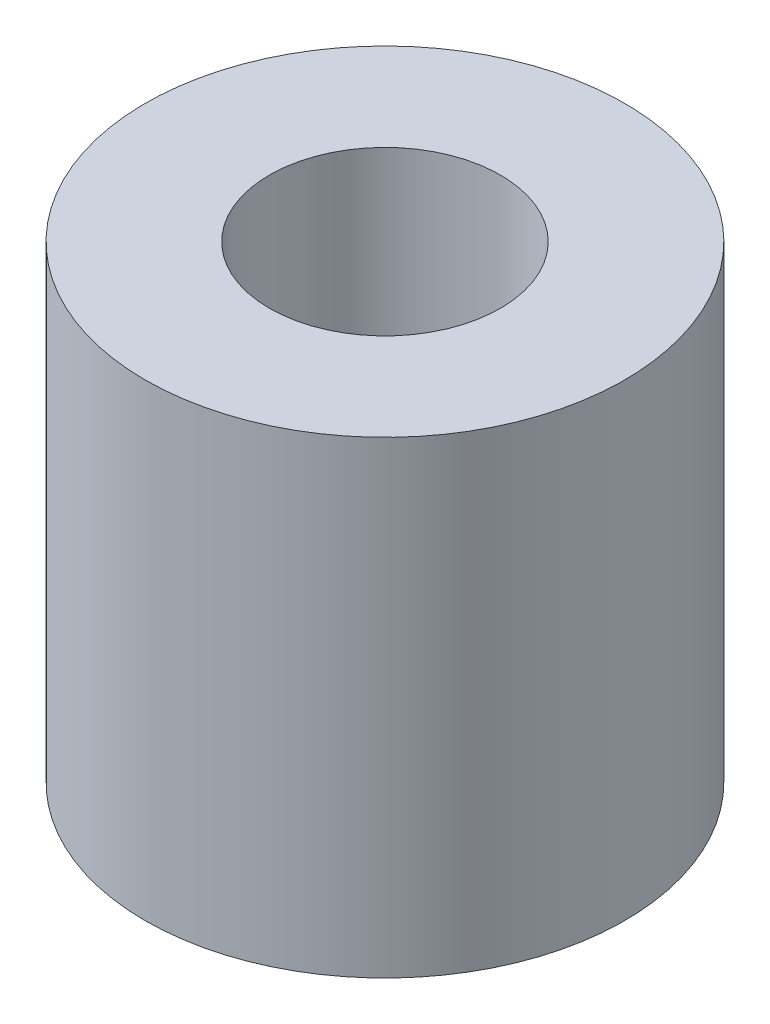
ISO-10303-21;
HEADER;
FILE_DESCRIPTION(('STEP AP214'),'2;1');
FILE_NAME('part.step','',(''),(''),'','','');
FILE_SCHEMA(('AUTOMOTIVE_DESIGN { 1 0 10303 214 1 1 1 1 }'));
ENDSEC;
DATA;
#1=APPLICATION_CONTEXT('core data for automotive mechanical design processes');
#2=APPLICATION_PROTOCOL_DEFINITION('international standard','automotive_design',2000,#1);
#3=PRODUCT_CONTEXT('',#1,'mechanical');
#4=PRODUCT('Part','Part','',(#3));
#5=PRODUCT_RELATED_PRODUCT_CATEGORY('part','',(#4));
#6=PRODUCT_DEFINITION_FORMATION('','',#4);
#7=PRODUCT_DEFINITION_CONTEXT('part definition',#1,'design');
#8=PRODUCT_DEFINITION('design','',#6,#7);
#9=PRODUCT_DEFINITION_SHAPE('','',#8);
#10=(LENGTH_UNIT() NAMED_UNIT(*) SI_UNIT(.MILLI.,.METRE.));
#11=(NAMED_UNIT(*) PLANE_ANGLE_UNIT() SI_UNIT($,.RADIAN.));
#12=(NAMED_UNIT(*) SI_UNIT($,.STERADIAN.) SOLID_ANGLE_UNIT());
#13=UNCERTAINTY_MEASURE_WITH_UNIT(LENGTH_MEASURE(1.E-05),#10,'distance_accuracy_value','');
#14=(GEOMETRIC_REPRESENTATION_CONTEXT(3) GLOBAL_UNCERTAINTY_ASSIGNED_CONTEXT((#13)) GLOBAL_UNIT_ASSIGNED_CONTEXT((#10,
#11,#12)) REPRESENTATION_CONTEXT('',''));
#15=CARTESIAN_POINT('',(0.,0.,0.));
#16=DIRECTION('',(0.,0.,1.));
#17=DIRECTION('',(1.,0.,0.));
#18=AXIS2_PLACEMENT_3D('',#15,#16,#17);
#19=CARTESIAN_POINT('',(0.,2.5,0.));
#20=DIRECTION('',(0.,1.,0.));
#21=DIRECTION('',(0.,0.,1.));
#22=AXIS2_PLACEMENT_3D('',#19,#20,#21);
#23=PLANE('',#22);
#24=CARTESIAN_POINT('',(0.,2.5,0.));
#25=DIRECTION('',(0.,1.,0.));
#26=DIRECTION('',(0.,0.,1.));
#27=AXIS2_PLACEMENT_3D('',#24,#25,#26);
#28=CIRCLE('',#27,2.55877098494928);
#29=CARTESIAN_POINT('',(0.,2.5,2.55877098494928));
#30=VERTEX_POINT('',#29);
#31=EDGE_CURVE('E10',#30,#30,#28,.T.);
#32=ORIENTED_EDGE('',*,*,#31,.T.);
#33=EDGE_LOOP('',(#32));
#34=FACE_BOUND('',#33,.T.);
#35=CARTESIAN_POINT('',(0.,2.5,0.));
#36=DIRECTION('',(0.,1.,0.));
#37=DIRECTION('',(0.,0.,1.));
#38=AXIS2_PLACEMENT_3D('',#35,#36,#37);
#39=CIRCLE('',#38,1.23298938086765);
#40=CARTESIAN_POINT('',(0.,2.5,1.23298938086765));
#41=VERTEX_POINT('',#40);
#42=EDGE_CURVE('E52',#41,#41,#39,.T.);
#43=ORIENTED_EDGE('',*,*,#42,.F.);
#44=EDGE_LOOP('',(#43));
#45=FACE_BOUND('',#44,.T.);
#46=ADVANCED_FACE('F41',(#34,#45),#23,.T.);
#47=CARTESIAN_POINT('',(0.,-2.5,0.));
#48=DIRECTION('',(0.,1.,0.));
#49=DIRECTION('',(0.,0.,1.));
#50=AXIS2_PLACEMENT_3D('',#47,#48,#49);
#51=PLANE('',#50);
#52=CARTESIAN_POINT('',(0.,-2.5,0.));
#53=DIRECTION('',(0.,1.,0.));
#54=DIRECTION('',(0.,0.,1.));
#55=AXIS2_PLACEMENT_3D('',#52,#53,#54);
#56=CIRCLE('',#55,2.55877098494928);
#57=CARTESIAN_POINT('',(0.,-2.5,2.55877098494928));
#58=VERTEX_POINT('',#57);
#59=EDGE_CURVE('E45',#58,#58,#56,.T.);
#60=ORIENTED_EDGE('',*,*,#59,.F.);
#61=EDGE_LOOP('',(#60));
#62=FACE_BOUND('',#61,.T.);
#63=CARTESIAN_POINT('',(0.,-2.5,0.));
#64=DIRECTION('',(0.,1.,0.));
#65=DIRECTION('',(0.,0.,1.));
#66=AXIS2_PLACEMENT_3D('',#63,#64,#65);
#67=CIRCLE('',#66,1.23298938086765);
#68=CARTESIAN_POINT('',(0.,-2.5,1.23298938086765));
#69=VERTEX_POINT('',#68);
#70=EDGE_CURVE('E54',#69,#69,#67,.T.);
#71=ORIENTED_EDGE('',*,*,#70,.T.);
#72=EDGE_LOOP('',(#71));
#73=FACE_BOUND('',#72,.T.);
#74=ADVANCED_FACE('F64',(#62,#73),#51,.F.);
#75=CARTESIAN_POINT('',(0.,2.5,0.));
#76=DIRECTION('',(0.,-1.,0.));
#77=DIRECTION('',(0.,0.,-1.));
#78=AXIS2_PLACEMENT_3D('',#75,#76,#77);
#79=CYLINDRICAL_SURFACE('',#78,2.55877098494928);
#80=ORIENTED_EDGE('',*,*,#31,.F.);
#81=EDGE_LOOP('',(#80));
#82=FACE_BOUND('',#81,.T.);
#83=ORIENTED_EDGE('',*,*,#59,.T.);
#84=EDGE_LOOP('',(#83));
#85=FACE_BOUND('',#84,.T.);
#86=ADVANCED_FACE('F43',(#82,#85),#79,.T.);
#87=CARTESIAN_POINT('',(0.,2.5,0.));
#88=DIRECTION('',(0.,-1.,0.));
#89=DIRECTION('',(0.,0.,-1.));
#90=AXIS2_PLACEMENT_3D('',#87,#88,#89);
#91=CYLINDRICAL_SURFACE('',#90,1.23298938086765);
#92=ORIENTED_EDGE('',*,*,#42,.T.);
#93=EDGE_LOOP('',(#92));
#94=FACE_BOUND('',#93,.T.);
#95=ORIENTED_EDGE('',*,*,#70,.F.);
#96=EDGE_LOOP('',(#95));
#97=FACE_BOUND('',#96,.T.);
#98=ADVANCED_FACE('F60',(#94,#97),#91,.F.);
#99=CLOSED_SHELL('',(#46,#74,#86,#98));
#100=MANIFOLD_SOLID_BREP('B2',#99);
#101=ADVANCED_BREP_SHAPE_REPRESENTATION('',(#18,#100),#14);
#102=SHAPE_DEFINITION_REPRESENTATION(#9,#101);
ENDSEC;
END-ISO-10303-21;
